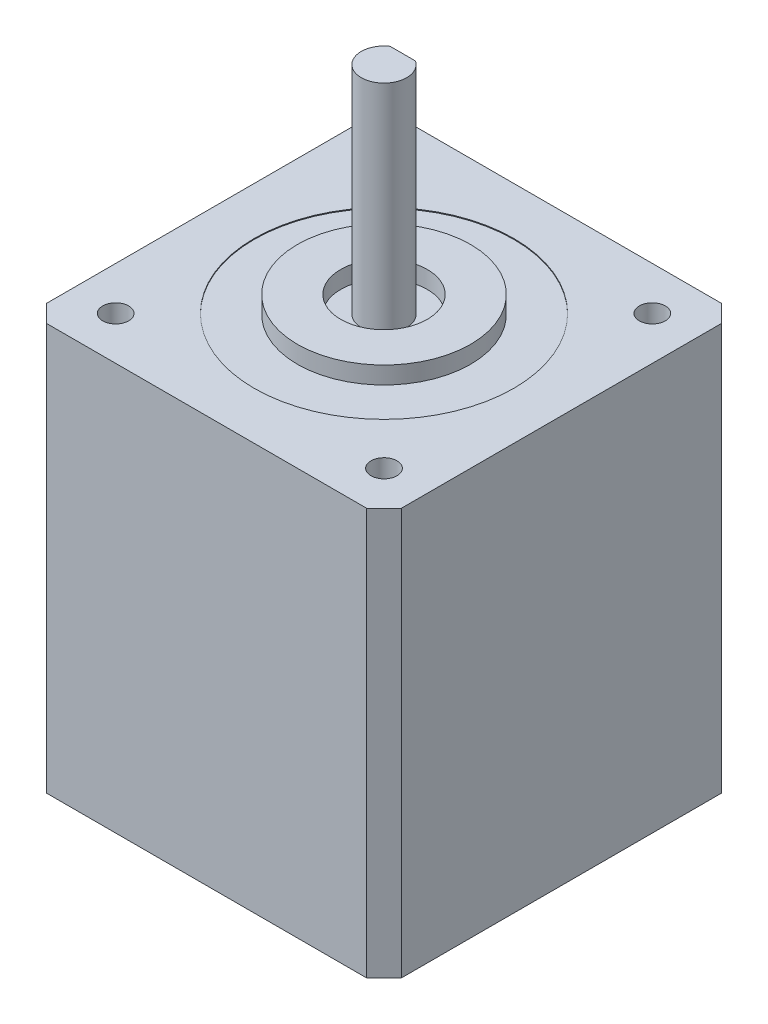
ISO-10303-21;
HEADER;
FILE_DESCRIPTION(('STEP AP214'),'2;1');
FILE_NAME('part.step','',(''),(''),'','','');
FILE_SCHEMA(('AUTOMOTIVE_DESIGN { 1 0 10303 214 1 1 1 1 }'));
ENDSEC;
DATA;
#1=APPLICATION_CONTEXT('core data for automotive mechanical design processes');
#2=APPLICATION_PROTOCOL_DEFINITION('international standard','automotive_design',2000,#1);
#3=PRODUCT_CONTEXT('',#1,'mechanical');
#4=PRODUCT('Part','Part','',(#3));
#5=PRODUCT_RELATED_PRODUCT_CATEGORY('part','',(#4));
#6=PRODUCT_DEFINITION_FORMATION('','',#4);
#7=PRODUCT_DEFINITION_CONTEXT('part definition',#1,'design');
#8=PRODUCT_DEFINITION('design','',#6,#7);
#9=PRODUCT_DEFINITION_SHAPE('','',#8);
#10=(LENGTH_UNIT() NAMED_UNIT(*) SI_UNIT(.MILLI.,.METRE.));
#11=(NAMED_UNIT(*) PLANE_ANGLE_UNIT() SI_UNIT($,.RADIAN.));
#12=(NAMED_UNIT(*) SI_UNIT($,.STERADIAN.) SOLID_ANGLE_UNIT());
#13=UNCERTAINTY_MEASURE_WITH_UNIT(LENGTH_MEASURE(1.E-05),#10,'distance_accuracy_value','');
#14=(GEOMETRIC_REPRESENTATION_CONTEXT(3) GLOBAL_UNCERTAINTY_ASSIGNED_CONTEXT((#13)) GLOBAL_UNIT_ASSIGNED_CONTEXT((#10,
#11,#12)) REPRESENTATION_CONTEXT('',''));
#15=CARTESIAN_POINT('',(0.,0.,0.));
#16=DIRECTION('',(0.,0.,1.));
#17=DIRECTION('',(1.,0.,0.));
#18=AXIS2_PLACEMENT_3D('',#15,#16,#17);
#19=CARTESIAN_POINT('',(0.,46.9,0.));
#20=DIRECTION('',(0.,1.,0.));
#21=DIRECTION('',(0.,0.,1.));
#22=AXIS2_PLACEMENT_3D('',#19,#20,#21);
#23=PLANE('',#22);
#24=CARTESIAN_POINT('',(0.,46.9,0.));
#25=DIRECTION('',(0.,1.,0.));
#26=DIRECTION('',(0.,0.,1.));
#27=AXIS2_PLACEMENT_3D('',#24,#25,#26);
#28=CIRCLE('',#27,5.);
#29=CARTESIAN_POINT('',(0.,46.9,5.));
#30=VERTEX_POINT('',#29);
#31=EDGE_CURVE('E11',#30,#30,#28,.F.);
#32=ORIENTED_EDGE('',*,*,#31,.F.);
#33=EDGE_LOOP('',(#32));
#34=FACE_BOUND('',#33,.T.);
#35=DIRECTION('',(-1.,0.,0.));
#36=VECTOR('',#35,1.);
#37=CARTESIAN_POINT('',(-1.47098416147173,46.9,-2.17535911633604));
#38=LINE('',#37,#36);
#39=CARTESIAN_POINT('',(1.47098416147173,46.9,-2.17535911633604));
#40=VERTEX_POINT('',#39);
#41=CARTESIAN_POINT('',(-1.47098416147173,46.9,-2.17535911633604));
#42=VERTEX_POINT('',#41);
#43=EDGE_CURVE('E257',#40,#42,#38,.T.);
#44=ORIENTED_EDGE('',*,*,#43,.F.);
#45=CARTESIAN_POINT('',(0.,46.9,0.));
#46=DIRECTION('',(0.,1.,0.));
#47=DIRECTION('',(0.,0.,1.));
#48=AXIS2_PLACEMENT_3D('',#45,#46,#47);
#49=CIRCLE('',#48,2.62602012336673);
#50=EDGE_CURVE('E59',#42,#40,#49,.T.);
#51=ORIENTED_EDGE('',*,*,#50,.F.);
#52=EDGE_LOOP('',(#44,#51));
#53=FACE_BOUND('',#52,.T.);
#54=ADVANCED_FACE('F43',(#34,#53),#23,.T.);
#55=CARTESIAN_POINT('',(0.,46.9,0.));
#56=DIRECTION('',(0.,1.,0.));
#57=DIRECTION('',(0.,0.,1.));
#58=AXIS2_PLACEMENT_3D('',#55,#56,#57);
#59=CIRCLE('',#58,15.);
#60=CARTESIAN_POINT('',(0.,46.9,15.));
#61=VERTEX_POINT('',#60);
#62=EDGE_CURVE('E163',#61,#61,#59,.T.);
#63=ORIENTED_EDGE('',*,*,#62,.T.);
#64=EDGE_LOOP('',(#63));
#65=FACE_BOUND('',#64,.T.);
#66=CARTESIAN_POINT('',(0.,46.9,0.));
#67=DIRECTION('',(0.,1.,0.));
#68=DIRECTION('',(0.,0.,1.));
#69=AXIS2_PLACEMENT_3D('',#66,#67,#68);
#70=CIRCLE('',#69,10.);
#71=CARTESIAN_POINT('',(0.,46.9,10.));
#72=VERTEX_POINT('',#71);
#73=EDGE_CURVE('E239',#72,#72,#70,.T.);
#74=ORIENTED_EDGE('',*,*,#73,.F.);
#75=EDGE_LOOP('',(#74));
#76=FACE_BOUND('',#75,.T.);
#77=ADVANCED_FACE('F333',(#65,#76),#23,.T.);
#78=CARTESIAN_POINT('',(-18.5,47.,-20.5));
#79=DIRECTION('',(0.,0.,1.));
#80=DIRECTION('',(1.,0.,0.));
#81=AXIS2_PLACEMENT_3D('',#78,#79,#80);
#82=PLANE('',#81);
#83=DIRECTION('',(-1.,0.,0.));
#84=VECTOR('',#83,1.);
#85=CARTESIAN_POINT('',(-18.5,0.,-20.5));
#86=LINE('',#85,#84);
#87=CARTESIAN_POINT('',(18.5,0.,-20.5));
#88=VERTEX_POINT('',#87);
#89=CARTESIAN_POINT('',(-18.5,0.,-20.5));
#90=VERTEX_POINT('',#89);
#91=EDGE_CURVE('E158',#88,#90,#86,.T.);
#92=ORIENTED_EDGE('',*,*,#91,.T.);
#93=DIRECTION('',(0.,-1.,0.));
#94=VECTOR('',#93,1.);
#95=CARTESIAN_POINT('',(-18.5,47.,-20.5));
#96=LINE('',#95,#94);
#97=CARTESIAN_POINT('',(-18.5,47.,-20.5));
#98=VERTEX_POINT('',#97);
#99=EDGE_CURVE('E52',#98,#90,#96,.T.);
#100=ORIENTED_EDGE('',*,*,#99,.F.);
#101=DIRECTION('',(-1.,0.,0.));
#102=VECTOR('',#101,1.);
#103=CARTESIAN_POINT('',(-18.5,47.,-20.5));
#104=LINE('',#103,#102);
#105=CARTESIAN_POINT('',(18.5,47.,-20.5));
#106=VERTEX_POINT('',#105);
#107=EDGE_CURVE('E182',#106,#98,#104,.T.);
#108=ORIENTED_EDGE('',*,*,#107,.F.);
#109=DIRECTION('',(0.,-1.,0.));
#110=VECTOR('',#109,1.);
#111=CARTESIAN_POINT('',(18.5,47.,-20.5));
#112=LINE('',#111,#110);
#113=EDGE_CURVE('E154',#106,#88,#112,.T.);
#114=ORIENTED_EDGE('',*,*,#113,.T.);
#115=EDGE_LOOP('',(#92,#100,#108,#114));
#116=FACE_BOUND('',#115,.T.);
#117=ADVANCED_FACE('F45',(#116),#82,.F.);
#118=CARTESIAN_POINT('',(-20.5,47.,-18.5));
#119=DIRECTION('',(0.707106781186547,0.,0.707106781186548));
#120=DIRECTION('',(0.707106781186548,0.,-0.707106781186547));
#121=AXIS2_PLACEMENT_3D('',#118,#119,#120);
#122=PLANE('',#121);
#123=DIRECTION('',(-0.707106781186548,0.,0.707106781186547));
#124=VECTOR('',#123,1.);
#125=CARTESIAN_POINT('',(-20.5,0.,-18.5));
#126=LINE('',#125,#124);
#127=CARTESIAN_POINT('',(-20.5,0.,-18.5));
#128=VERTEX_POINT('',#127);
#129=EDGE_CURVE('E162',#90,#128,#126,.T.);
#130=ORIENTED_EDGE('',*,*,#129,.T.);
#131=DIRECTION('',(0.,-1.,0.));
#132=VECTOR('',#131,1.);
#133=CARTESIAN_POINT('',(-20.5,47.,-18.5));
#134=LINE('',#133,#132);
#135=CARTESIAN_POINT('',(-20.5,47.,-18.5));
#136=VERTEX_POINT('',#135);
#137=EDGE_CURVE('E197',#136,#128,#134,.T.);
#138=ORIENTED_EDGE('',*,*,#137,.F.);
#139=DIRECTION('',(-0.707106781186548,0.,0.707106781186547));
#140=VECTOR('',#139,1.);
#141=CARTESIAN_POINT('',(-20.5,47.,-18.5));
#142=LINE('',#141,#140);
#143=EDGE_CURVE('E110',#98,#136,#142,.T.);
#144=ORIENTED_EDGE('',*,*,#143,.F.);
#145=ORIENTED_EDGE('',*,*,#99,.T.);
#146=EDGE_LOOP('',(#130,#138,#144,#145));
#147=FACE_BOUND('',#146,.T.);
#148=ADVANCED_FACE('F202',(#147),#122,.F.);
#149=CARTESIAN_POINT('',(-20.5,47.,18.5));
#150=DIRECTION('',(1.,0.,0.));
#151=DIRECTION('',(0.,0.,-1.));
#152=AXIS2_PLACEMENT_3D('',#149,#150,#151);
#153=PLANE('',#152);
#154=DIRECTION('',(0.,0.,1.));
#155=VECTOR('',#154,1.);
#156=CARTESIAN_POINT('',(-20.5,0.,18.5));
#157=LINE('',#156,#155);
#158=CARTESIAN_POINT('',(-20.5,0.,18.5));
#159=VERTEX_POINT('',#158);
#160=EDGE_CURVE('E166',#128,#159,#157,.T.);
#161=ORIENTED_EDGE('',*,*,#160,.T.);
#162=DIRECTION('',(0.,-1.,0.));
#163=VECTOR('',#162,1.);
#164=CARTESIAN_POINT('',(-20.5,47.,18.5));
#165=LINE('',#164,#163);
#166=CARTESIAN_POINT('',(-20.5,47.,18.5));
#167=VERTEX_POINT('',#166);
#168=EDGE_CURVE('E193',#167,#159,#165,.T.);
#169=ORIENTED_EDGE('',*,*,#168,.F.);
#170=DIRECTION('',(0.,0.,1.));
#171=VECTOR('',#170,1.);
#172=CARTESIAN_POINT('',(-20.5,47.,18.5));
#173=LINE('',#172,#171);
#174=EDGE_CURVE('E221',#136,#167,#173,.T.);
#175=ORIENTED_EDGE('',*,*,#174,.F.);
#176=ORIENTED_EDGE('',*,*,#137,.T.);
#177=EDGE_LOOP('',(#161,#169,#175,#176));
#178=FACE_BOUND('',#177,.T.);
#179=ADVANCED_FACE('F213',(#178),#153,.F.);
#180=CARTESIAN_POINT('',(-18.5,47.,20.5));
#181=DIRECTION('',(0.707106781186547,0.,-0.707106781186548));
#182=DIRECTION('',(-0.707106781186548,0.,-0.707106781186547));
#183=AXIS2_PLACEMENT_3D('',#180,#181,#182);
#184=PLANE('',#183);
#185=DIRECTION('',(0.707106781186548,0.,0.707106781186547));
#186=VECTOR('',#185,1.);
#187=CARTESIAN_POINT('',(-18.5,0.,20.5));
#188=LINE('',#187,#186);
#189=CARTESIAN_POINT('',(-18.5,0.,20.5));
#190=VERTEX_POINT('',#189);
#191=EDGE_CURVE('E169',#159,#190,#188,.T.);
#192=ORIENTED_EDGE('',*,*,#191,.T.);
#193=DIRECTION('',(0.,-1.,0.));
#194=VECTOR('',#193,1.);
#195=CARTESIAN_POINT('',(-18.5,47.,20.5));
#196=LINE('',#195,#194);
#197=CARTESIAN_POINT('',(-18.5,47.,20.5));
#198=VERTEX_POINT('',#197);
#199=EDGE_CURVE('E189',#198,#190,#196,.T.);
#200=ORIENTED_EDGE('',*,*,#199,.F.);
#201=DIRECTION('',(0.707106781186548,0.,0.707106781186547));
#202=VECTOR('',#201,1.);
#203=CARTESIAN_POINT('',(-18.5,47.,20.5));
#204=LINE('',#203,#202);
#205=EDGE_CURVE('E219',#167,#198,#204,.T.);
#206=ORIENTED_EDGE('',*,*,#205,.F.);
#207=ORIENTED_EDGE('',*,*,#168,.T.);
#208=EDGE_LOOP('',(#192,#200,#206,#207));
#209=FACE_BOUND('',#208,.T.);
#210=ADVANCED_FACE('F217',(#209),#184,.F.);
#211=CARTESIAN_POINT('',(-18.5,47.,20.5));
#212=DIRECTION('',(0.,0.,-1.));
#213=DIRECTION('',(-1.,0.,0.));
#214=AXIS2_PLACEMENT_3D('',#211,#212,#213);
#215=PLANE('',#214);
#216=DIRECTION('',(1.,0.,0.));
#217=VECTOR('',#216,1.);
#218=CARTESIAN_POINT('',(-18.5,0.,20.5));
#219=LINE('',#218,#217);
#220=CARTESIAN_POINT('',(18.5,0.,20.5));
#221=VERTEX_POINT('',#220);
#222=EDGE_CURVE('E172',#190,#221,#219,.T.);
#223=ORIENTED_EDGE('',*,*,#222,.T.);
#224=DIRECTION('',(0.,-1.,0.));
#225=VECTOR('',#224,1.);
#226=CARTESIAN_POINT('',(18.5,47.,20.5));
#227=LINE('',#226,#225);
#228=CARTESIAN_POINT('',(18.5,47.,20.5));
#229=VERTEX_POINT('',#228);
#230=EDGE_CURVE('E147',#229,#221,#227,.T.);
#231=ORIENTED_EDGE('',*,*,#230,.F.);
#232=DIRECTION('',(1.,0.,0.));
#233=VECTOR('',#232,1.);
#234=CARTESIAN_POINT('',(-18.5,47.,20.5));
#235=LINE('',#234,#233);
#236=EDGE_CURVE('E133',#198,#229,#235,.T.);
#237=ORIENTED_EDGE('',*,*,#236,.F.);
#238=ORIENTED_EDGE('',*,*,#199,.T.);
#239=EDGE_LOOP('',(#223,#231,#237,#238));
#240=FACE_BOUND('',#239,.T.);
#241=ADVANCED_FACE('F496',(#240),#215,.F.);
#242=CARTESIAN_POINT('',(18.5,47.,20.5));
#243=DIRECTION('',(-0.707106781186547,0.,-0.707106781186548));
#244=DIRECTION('',(-0.707106781186548,0.,0.707106781186547));
#245=AXIS2_PLACEMENT_3D('',#242,#243,#244);
#246=PLANE('',#245);
#247=DIRECTION('',(0.707106781186548,0.,-0.707106781186547));
#248=VECTOR('',#247,1.);
#249=CARTESIAN_POINT('',(18.5,0.,20.5));
#250=LINE('',#249,#248);
#251=CARTESIAN_POINT('',(20.5,0.,18.5));
#252=VERTEX_POINT('',#251);
#253=EDGE_CURVE('E143',#221,#252,#250,.T.);
#254=ORIENTED_EDGE('',*,*,#253,.T.);
#255=DIRECTION('',(0.,-1.,0.));
#256=VECTOR('',#255,1.);
#257=CARTESIAN_POINT('',(20.5,47.,18.5));
#258=LINE('',#257,#256);
#259=CARTESIAN_POINT('',(20.5,47.,18.5));
#260=VERTEX_POINT('',#259);
#261=EDGE_CURVE('E140',#260,#252,#258,.T.);
#262=ORIENTED_EDGE('',*,*,#261,.F.);
#263=DIRECTION('',(0.707106781186548,0.,-0.707106781186547));
#264=VECTOR('',#263,1.);
#265=CARTESIAN_POINT('',(18.5,47.,20.5));
#266=LINE('',#265,#264);
#267=EDGE_CURVE('E126',#229,#260,#266,.T.);
#268=ORIENTED_EDGE('',*,*,#267,.F.);
#269=ORIENTED_EDGE('',*,*,#230,.T.);
#270=EDGE_LOOP('',(#254,#262,#268,#269));
#271=FACE_BOUND('',#270,.T.);
#272=ADVANCED_FACE('F141',(#271),#246,.F.);
#273=CARTESIAN_POINT('',(20.5,47.,18.5));
#274=DIRECTION('',(-1.,0.,0.));
#275=DIRECTION('',(0.,0.,1.));
#276=AXIS2_PLACEMENT_3D('',#273,#274,#275);
#277=PLANE('',#276);
#278=DIRECTION('',(0.,0.,-1.));
#279=VECTOR('',#278,1.);
#280=CARTESIAN_POINT('',(20.5,0.,18.5));
#281=LINE('',#280,#279);
#282=CARTESIAN_POINT('',(20.5,0.,-18.5));
#283=VERTEX_POINT('',#282);
#284=EDGE_CURVE('E177',#252,#283,#281,.T.);
#285=ORIENTED_EDGE('',*,*,#284,.T.);
#286=DIRECTION('',(0.,-1.,0.));
#287=VECTOR('',#286,1.);
#288=CARTESIAN_POINT('',(20.5,47.,-18.5));
#289=LINE('',#288,#287);
#290=CARTESIAN_POINT('',(20.5,47.,-18.5));
#291=VERTEX_POINT('',#290);
#292=EDGE_CURVE('E148',#291,#283,#289,.T.);
#293=ORIENTED_EDGE('',*,*,#292,.F.);
#294=DIRECTION('',(0.,0.,-1.));
#295=VECTOR('',#294,1.);
#296=CARTESIAN_POINT('',(20.5,47.,18.5));
#297=LINE('',#296,#295);
#298=EDGE_CURVE('E130',#260,#291,#297,.T.);
#299=ORIENTED_EDGE('',*,*,#298,.F.);
#300=ORIENTED_EDGE('',*,*,#261,.T.);
#301=EDGE_LOOP('',(#285,#293,#299,#300));
#302=FACE_BOUND('',#301,.T.);
#303=ADVANCED_FACE('F150',(#302),#277,.F.);
#304=CARTESIAN_POINT('',(20.5,47.,-18.5));
#305=DIRECTION('',(-0.707106781186547,0.,0.707106781186547));
#306=DIRECTION('',(0.707106781186548,0.,0.707106781186548));
#307=AXIS2_PLACEMENT_3D('',#304,#305,#306);
#308=PLANE('',#307);
#309=DIRECTION('',(-0.707106781186547,0.,-0.707106781186547));
#310=VECTOR('',#309,1.);
#311=CARTESIAN_POINT('',(20.5,0.,-18.5));
#312=LINE('',#311,#310);
#313=EDGE_CURVE('E101',#283,#88,#312,.T.);
#314=ORIENTED_EDGE('',*,*,#313,.T.);
#315=ORIENTED_EDGE('',*,*,#113,.F.);
#316=DIRECTION('',(-0.707106781186547,0.,-0.707106781186547));
#317=VECTOR('',#316,1.);
#318=CARTESIAN_POINT('',(20.5,47.,-18.5));
#319=LINE('',#318,#317);
#320=EDGE_CURVE('E68',#291,#106,#319,.T.);
#321=ORIENTED_EDGE('',*,*,#320,.F.);
#322=ORIENTED_EDGE('',*,*,#292,.T.);
#323=EDGE_LOOP('',(#314,#315,#321,#322));
#324=FACE_BOUND('',#323,.T.);
#325=ADVANCED_FACE('F307',(#324),#308,.F.);
#326=CARTESIAN_POINT('',(20.5,47.,-20.5));
#327=DIRECTION('',(0.,1.,0.));
#328=DIRECTION('',(0.,0.,1.));
#329=AXIS2_PLACEMENT_3D('',#326,#327,#328);
#330=PLANE('',#329);
#331=CARTESIAN_POINT('',(15.5,47.,-15.5));
#332=DIRECTION('',(0.,1.,0.));
#333=DIRECTION('',(0.,0.,1.));
#334=AXIS2_PLACEMENT_3D('',#331,#332,#333);
#335=CIRCLE('',#334,1.5);
#336=CARTESIAN_POINT('',(15.5,47.,-14.));
#337=VERTEX_POINT('',#336);
#338=EDGE_CURVE('E298',#337,#337,#335,.T.);
#339=ORIENTED_EDGE('',*,*,#338,.F.);
#340=EDGE_LOOP('',(#339));
#341=FACE_BOUND('',#340,.T.);
#342=CARTESIAN_POINT('',(-15.5,47.,-15.5));
#343=DIRECTION('',(0.,1.,0.));
#344=DIRECTION('',(0.,0.,1.));
#345=AXIS2_PLACEMENT_3D('',#342,#343,#344);
#346=CIRCLE('',#345,1.5);
#347=CARTESIAN_POINT('',(-15.5,47.,-14.));
#348=VERTEX_POINT('',#347);
#349=EDGE_CURVE('E290',#348,#348,#346,.T.);
#350=ORIENTED_EDGE('',*,*,#349,.F.);
#351=EDGE_LOOP('',(#350));
#352=FACE_BOUND('',#351,.T.);
#353=CARTESIAN_POINT('',(-15.5,47.,15.5));
#354=DIRECTION('',(0.,1.,0.));
#355=DIRECTION('',(0.,0.,1.));
#356=AXIS2_PLACEMENT_3D('',#353,#354,#355);
#357=CIRCLE('',#356,1.5);
#358=CARTESIAN_POINT('',(-15.5,47.,17.));
#359=VERTEX_POINT('',#358);
#360=EDGE_CURVE('E282',#359,#359,#357,.T.);
#361=ORIENTED_EDGE('',*,*,#360,.F.);
#362=EDGE_LOOP('',(#361));
#363=FACE_BOUND('',#362,.T.);
#364=CARTESIAN_POINT('',(15.5,47.,15.5));
#365=DIRECTION('',(0.,1.,0.));
#366=DIRECTION('',(0.,0.,1.));
#367=AXIS2_PLACEMENT_3D('',#364,#365,#366);
#368=CIRCLE('',#367,1.5);
#369=CARTESIAN_POINT('',(15.5,47.,17.));
#370=VERTEX_POINT('',#369);
#371=EDGE_CURVE('E274',#370,#370,#368,.T.);
#372=ORIENTED_EDGE('',*,*,#371,.F.);
#373=EDGE_LOOP('',(#372));
#374=FACE_BOUND('',#373,.T.);
#375=CARTESIAN_POINT('',(0.,47.,0.));
#376=DIRECTION('',(0.,1.,0.));
#377=DIRECTION('',(0.,0.,1.));
#378=AXIS2_PLACEMENT_3D('',#375,#376,#377);
#379=CIRCLE('',#378,15.);
#380=CARTESIAN_POINT('',(0.,47.,15.));
#381=VERTEX_POINT('',#380);
#382=EDGE_CURVE('E231',#381,#381,#379,.T.);
#383=ORIENTED_EDGE('',*,*,#382,.F.);
#384=EDGE_LOOP('',(#383));
#385=FACE_BOUND('',#384,.T.);
#386=ORIENTED_EDGE('',*,*,#107,.T.);
#387=ORIENTED_EDGE('',*,*,#143,.T.);
#388=ORIENTED_EDGE('',*,*,#174,.T.);
#389=ORIENTED_EDGE('',*,*,#205,.T.);
#390=ORIENTED_EDGE('',*,*,#236,.T.);
#391=ORIENTED_EDGE('',*,*,#267,.T.);
#392=ORIENTED_EDGE('',*,*,#298,.T.);
#393=ORIENTED_EDGE('',*,*,#320,.T.);
#394=EDGE_LOOP('',(#386,#387,#388,#389,#390,#391,#392,#393));
#395=FACE_BOUND('',#394,.T.);
#396=ADVANCED_FACE('F128',(#341,#352,#363,#374,#385,#395),#330,.T.);
#397=CARTESIAN_POINT('',(20.5,0.,-20.5));
#398=DIRECTION('',(0.,1.,0.));
#399=DIRECTION('',(0.,0.,1.));
#400=AXIS2_PLACEMENT_3D('',#397,#398,#399);
#401=PLANE('',#400);
#402=ORIENTED_EDGE('',*,*,#91,.F.);
#403=ORIENTED_EDGE('',*,*,#313,.F.);
#404=ORIENTED_EDGE('',*,*,#284,.F.);
#405=ORIENTED_EDGE('',*,*,#253,.F.);
#406=ORIENTED_EDGE('',*,*,#222,.F.);
#407=ORIENTED_EDGE('',*,*,#191,.F.);
#408=ORIENTED_EDGE('',*,*,#160,.F.);
#409=ORIENTED_EDGE('',*,*,#129,.F.);
#410=EDGE_LOOP('',(#402,#403,#404,#405,#406,#407,#408,#409));
#411=FACE_BOUND('',#410,.T.);
#412=ADVANCED_FACE('F207',(#411),#401,.F.);
#413=CARTESIAN_POINT('',(0.,46.9,0.));
#414=DIRECTION('',(0.,1.,0.));
#415=DIRECTION('',(0.,0.,1.));
#416=AXIS2_PLACEMENT_3D('',#413,#414,#415);
#417=CYLINDRICAL_SURFACE('',#416,15.);
#418=ORIENTED_EDGE('',*,*,#62,.F.);
#419=EDGE_LOOP('',(#418));
#420=FACE_BOUND('',#419,.T.);
#421=ORIENTED_EDGE('',*,*,#382,.T.);
#422=EDGE_LOOP('',(#421));
#423=FACE_BOUND('',#422,.T.);
#424=ADVANCED_FACE('F317',(#420,#423),#417,.F.);
#425=CARTESIAN_POINT('',(0.,48.9,0.));
#426=DIRECTION('',(0.,1.,0.));
#427=DIRECTION('',(0.,0.,1.));
#428=AXIS2_PLACEMENT_3D('',#425,#426,#427);
#429=PLANE('',#428);
#430=CARTESIAN_POINT('',(0.,48.9,0.));
#431=DIRECTION('',(0.,1.,0.));
#432=DIRECTION('',(0.,0.,1.));
#433=AXIS2_PLACEMENT_3D('',#430,#431,#432);
#434=CIRCLE('',#433,10.);
#435=CARTESIAN_POINT('',(0.,48.9,10.));
#436=VERTEX_POINT('',#435);
#437=EDGE_CURVE('E235',#436,#436,#434,.T.);
#438=ORIENTED_EDGE('',*,*,#437,.T.);
#439=EDGE_LOOP('',(#438));
#440=FACE_BOUND('',#439,.T.);
#441=CARTESIAN_POINT('',(0.,48.9,0.));
#442=DIRECTION('',(0.,1.,0.));
#443=DIRECTION('',(0.,0.,1.));
#444=AXIS2_PLACEMENT_3D('',#441,#442,#443);
#445=CIRCLE('',#444,5.);
#446=CARTESIAN_POINT('',(0.,48.9,5.));
#447=VERTEX_POINT('',#446);
#448=EDGE_CURVE('E243',#447,#447,#445,.T.);
#449=ORIENTED_EDGE('',*,*,#448,.F.);
#450=EDGE_LOOP('',(#449));
#451=FACE_BOUND('',#450,.T.);
#452=ADVANCED_FACE('F319',(#440,#451),#429,.T.);
#453=CARTESIAN_POINT('',(0.,48.9,0.));
#454=DIRECTION('',(0.,-1.,0.));
#455=DIRECTION('',(0.,0.,-1.));
#456=AXIS2_PLACEMENT_3D('',#453,#454,#455);
#457=CYLINDRICAL_SURFACE('',#456,10.);
#458=ORIENTED_EDGE('',*,*,#437,.F.);
#459=EDGE_LOOP('',(#458));
#460=FACE_BOUND('',#459,.T.);
#461=ORIENTED_EDGE('',*,*,#73,.T.);
#462=EDGE_LOOP('',(#461));
#463=FACE_BOUND('',#462,.T.);
#464=ADVANCED_FACE('F326',(#460,#463),#457,.T.);
#465=CARTESIAN_POINT('',(0.,48.9,0.));
#466=DIRECTION('',(0.,-1.,0.));
#467=DIRECTION('',(0.,0.,-1.));
#468=AXIS2_PLACEMENT_3D('',#465,#466,#467);
#469=CYLINDRICAL_SURFACE('',#468,5.);
#470=ORIENTED_EDGE('',*,*,#448,.T.);
#471=EDGE_LOOP('',(#470));
#472=FACE_BOUND('',#471,.T.);
#473=ORIENTED_EDGE('',*,*,#31,.T.);
#474=EDGE_LOOP('',(#473));
#475=FACE_BOUND('',#474,.T.);
#476=ADVANCED_FACE('F343',(#472,#475),#469,.F.);
#477=CARTESIAN_POINT('',(0.,71.9,0.));
#478=DIRECTION('',(0.,-1.,0.));
#479=DIRECTION('',(0.,0.,-1.));
#480=AXIS2_PLACEMENT_3D('',#477,#478,#479);
#481=CYLINDRICAL_SURFACE('',#480,2.62602012336673);
#482=ORIENTED_EDGE('',*,*,#50,.T.);
#483=DIRECTION('',(0.,-1.,0.));
#484=VECTOR('',#483,1.);
#485=CARTESIAN_POINT('',(1.47098416147173,71.9,-2.17535911633604));
#486=LINE('',#485,#484);
#487=CARTESIAN_POINT('',(1.47098416147173,71.9,-2.17535911633604));
#488=VERTEX_POINT('',#487);
#489=EDGE_CURVE('E250',#488,#40,#486,.T.);
#490=ORIENTED_EDGE('',*,*,#489,.F.);
#491=CARTESIAN_POINT('',(0.,71.9,0.));
#492=DIRECTION('',(0.,1.,0.));
#493=DIRECTION('',(0.,0.,1.));
#494=AXIS2_PLACEMENT_3D('',#491,#492,#493);
#495=CIRCLE('',#494,2.62602012336673);
#496=CARTESIAN_POINT('',(-1.47098416147173,71.9,-2.17535911633604));
#497=VERTEX_POINT('',#496);
#498=EDGE_CURVE('E261',#497,#488,#495,.T.);
#499=ORIENTED_EDGE('',*,*,#498,.F.);
#500=DIRECTION('',(0.,-1.,0.));
#501=VECTOR('',#500,1.);
#502=CARTESIAN_POINT('',(-1.47098416147173,71.9,-2.17535911633604));
#503=LINE('',#502,#501);
#504=EDGE_CURVE('E253',#497,#42,#503,.T.);
#505=ORIENTED_EDGE('',*,*,#504,.T.);
#506=EDGE_LOOP('',(#482,#490,#499,#505));
#507=FACE_BOUND('',#506,.T.);
#508=ADVANCED_FACE('F348',(#507),#481,.T.);
#509=CARTESIAN_POINT('',(-1.47098416147173,71.9,-2.17535911633604));
#510=DIRECTION('',(0.,0.,1.));
#511=DIRECTION('',(1.,0.,0.));
#512=AXIS2_PLACEMENT_3D('',#509,#510,#511);
#513=PLANE('',#512);
#514=ORIENTED_EDGE('',*,*,#43,.T.);
#515=ORIENTED_EDGE('',*,*,#504,.F.);
#516=DIRECTION('',(-1.,0.,0.));
#517=VECTOR('',#516,1.);
#518=CARTESIAN_POINT('',(-1.47098416147173,71.9,-2.17535911633604));
#519=LINE('',#518,#517);
#520=EDGE_CURVE('E256',#488,#497,#519,.T.);
#521=ORIENTED_EDGE('',*,*,#520,.F.);
#522=ORIENTED_EDGE('',*,*,#489,.T.);
#523=EDGE_LOOP('',(#514,#515,#521,#522));
#524=FACE_BOUND('',#523,.T.);
#525=ADVANCED_FACE('F352',(#524),#513,.F.);
#526=CARTESIAN_POINT('',(0.,71.9,0.));
#527=DIRECTION('',(0.,1.,0.));
#528=DIRECTION('',(0.,0.,1.));
#529=AXIS2_PLACEMENT_3D('',#526,#527,#528);
#530=PLANE('',#529);
#531=ORIENTED_EDGE('',*,*,#498,.T.);
#532=ORIENTED_EDGE('',*,*,#520,.T.);
#533=EDGE_LOOP('',(#531,#532));
#534=FACE_BOUND('',#533,.T.);
#535=ADVANCED_FACE('F355',(#534),#530,.T.);
#536=CARTESIAN_POINT('',(15.5,42.,15.5));
#537=DIRECTION('',(0.,1.,0.));
#538=DIRECTION('',(0.,0.,1.));
#539=AXIS2_PLACEMENT_3D('',#536,#537,#538);
#540=CONICAL_SURFACE('',#539,1.5,1.02974425867665);
#541=CARTESIAN_POINT('',(15.5,41.0987090714587,15.5));
#542=VERTEX_POINT('',#541);
#543=VERTEX_LOOP('',#542);
#544=FACE_BOUND('',#543,.T.);
#545=CARTESIAN_POINT('',(15.5,42.,15.5));
#546=DIRECTION('',(0.,1.,0.));
#547=DIRECTION('',(0.,0.,1.));
#548=AXIS2_PLACEMENT_3D('',#545,#546,#547);
#549=CIRCLE('',#548,1.5);
#550=CARTESIAN_POINT('',(15.5,42.,17.));
#551=VERTEX_POINT('',#550);
#552=EDGE_CURVE('E264',#551,#551,#549,.T.);
#553=ORIENTED_EDGE('',*,*,#552,.T.);
#554=EDGE_LOOP('',(#553));
#555=FACE_BOUND('',#554,.T.);
#556=ADVANCED_FACE('F359',(#544,#555),#540,.F.);
#557=CARTESIAN_POINT('',(15.5,47.,15.5));
#558=DIRECTION('',(0.,1.,0.));
#559=DIRECTION('',(0.,0.,1.));
#560=AXIS2_PLACEMENT_3D('',#557,#558,#559);
#561=CYLINDRICAL_SURFACE('',#560,1.5);
#562=ORIENTED_EDGE('',*,*,#552,.F.);
#563=EDGE_LOOP('',(#562));
#564=FACE_BOUND('',#563,.T.);
#565=ORIENTED_EDGE('',*,*,#371,.T.);
#566=EDGE_LOOP('',(#565));
#567=FACE_BOUND('',#566,.T.);
#568=ADVANCED_FACE('F363',(#564,#567),#561,.F.);
#569=CARTESIAN_POINT('',(-15.5,42.,15.5));
#570=DIRECTION('',(0.,1.,0.));
#571=DIRECTION('',(0.,0.,1.));
#572=AXIS2_PLACEMENT_3D('',#569,#570,#571);
#573=CONICAL_SURFACE('',#572,1.5,1.02974425867665);
#574=CARTESIAN_POINT('',(-15.5,41.0987090714587,15.5));
#575=VERTEX_POINT('',#574);
#576=VERTEX_LOOP('',#575);
#577=FACE_BOUND('',#576,.T.);
#578=CARTESIAN_POINT('',(-15.5,42.,15.5));
#579=DIRECTION('',(0.,1.,0.));
#580=DIRECTION('',(0.,0.,1.));
#581=AXIS2_PLACEMENT_3D('',#578,#579,#580);
#582=CIRCLE('',#581,1.5);
#583=CARTESIAN_POINT('',(-15.5,42.,17.));
#584=VERTEX_POINT('',#583);
#585=EDGE_CURVE('E278',#584,#584,#582,.T.);
#586=ORIENTED_EDGE('',*,*,#585,.T.);
#587=EDGE_LOOP('',(#586));
#588=FACE_BOUND('',#587,.T.);
#589=ADVANCED_FACE('F367',(#577,#588),#573,.F.);
#590=CARTESIAN_POINT('',(-15.5,47.,15.5));
#591=DIRECTION('',(0.,1.,0.));
#592=DIRECTION('',(0.,0.,1.));
#593=AXIS2_PLACEMENT_3D('',#590,#591,#592);
#594=CYLINDRICAL_SURFACE('',#593,1.5);
#595=ORIENTED_EDGE('',*,*,#585,.F.);
#596=EDGE_LOOP('',(#595));
#597=FACE_BOUND('',#596,.T.);
#598=ORIENTED_EDGE('',*,*,#360,.T.);
#599=EDGE_LOOP('',(#598));
#600=FACE_BOUND('',#599,.T.);
#601=ADVANCED_FACE('F371',(#597,#600),#594,.F.);
#602=CARTESIAN_POINT('',(-15.5,42.,-15.5));
#603=DIRECTION('',(0.,1.,0.));
#604=DIRECTION('',(0.,0.,1.));
#605=AXIS2_PLACEMENT_3D('',#602,#603,#604);
#606=CONICAL_SURFACE('',#605,1.5,1.02974425867665);
#607=CARTESIAN_POINT('',(-15.5,41.0987090714587,-15.5));
#608=VERTEX_POINT('',#607);
#609=VERTEX_LOOP('',#608);
#610=FACE_BOUND('',#609,.T.);
#611=CARTESIAN_POINT('',(-15.5,42.,-15.5));
#612=DIRECTION('',(0.,1.,0.));
#613=DIRECTION('',(0.,0.,1.));
#614=AXIS2_PLACEMENT_3D('',#611,#612,#613);
#615=CIRCLE('',#614,1.5);
#616=CARTESIAN_POINT('',(-15.5,42.,-14.));
#617=VERTEX_POINT('',#616);
#618=EDGE_CURVE('E286',#617,#617,#615,.T.);
#619=ORIENTED_EDGE('',*,*,#618,.T.);
#620=EDGE_LOOP('',(#619));
#621=FACE_BOUND('',#620,.T.);
#622=ADVANCED_FACE('F375',(#610,#621),#606,.F.);
#623=CARTESIAN_POINT('',(-15.5,47.,-15.5));
#624=DIRECTION('',(0.,1.,0.));
#625=DIRECTION('',(0.,0.,1.));
#626=AXIS2_PLACEMENT_3D('',#623,#624,#625);
#627=CYLINDRICAL_SURFACE('',#626,1.5);
#628=ORIENTED_EDGE('',*,*,#618,.F.);
#629=EDGE_LOOP('',(#628));
#630=FACE_BOUND('',#629,.T.);
#631=ORIENTED_EDGE('',*,*,#349,.T.);
#632=EDGE_LOOP('',(#631));
#633=FACE_BOUND('',#632,.T.);
#634=ADVANCED_FACE('F379',(#630,#633),#627,.F.);
#635=CARTESIAN_POINT('',(15.5,42.,-15.5));
#636=DIRECTION('',(0.,1.,0.));
#637=DIRECTION('',(0.,0.,1.));
#638=AXIS2_PLACEMENT_3D('',#635,#636,#637);
#639=CONICAL_SURFACE('',#638,1.5,1.02974425867665);
#640=CARTESIAN_POINT('',(15.5,41.0987090714587,-15.5));
#641=VERTEX_POINT('',#640);
#642=VERTEX_LOOP('',#641);
#643=FACE_BOUND('',#642,.T.);
#644=CARTESIAN_POINT('',(15.5,42.,-15.5));
#645=DIRECTION('',(0.,1.,0.));
#646=DIRECTION('',(0.,0.,1.));
#647=AXIS2_PLACEMENT_3D('',#644,#645,#646);
#648=CIRCLE('',#647,1.5);
#649=CARTESIAN_POINT('',(15.5,42.,-14.));
#650=VERTEX_POINT('',#649);
#651=EDGE_CURVE('E294',#650,#650,#648,.T.);
#652=ORIENTED_EDGE('',*,*,#651,.T.);
#653=EDGE_LOOP('',(#652));
#654=FACE_BOUND('',#653,.T.);
#655=ADVANCED_FACE('F383',(#643,#654),#639,.F.);
#656=CARTESIAN_POINT('',(15.5,47.,-15.5));
#657=DIRECTION('',(0.,1.,0.));
#658=DIRECTION('',(0.,0.,1.));
#659=AXIS2_PLACEMENT_3D('',#656,#657,#658);
#660=CYLINDRICAL_SURFACE('',#659,1.5);
#661=ORIENTED_EDGE('',*,*,#651,.F.);
#662=EDGE_LOOP('',(#661));
#663=FACE_BOUND('',#662,.T.);
#664=ORIENTED_EDGE('',*,*,#338,.T.);
#665=EDGE_LOOP('',(#664));
#666=FACE_BOUND('',#665,.T.);
#667=ADVANCED_FACE('F303',(#663,#666),#660,.F.);
#668=CLOSED_SHELL('',(#54,#77,#117,#148,#179,#210,#241,#272,#303,#325,#396,#412,#424,#452,#464,
#476,#508,#525,#535,#556,#568,#589,#601,#622,#634,#655,#667));
#669=MANIFOLD_SOLID_BREP('B2',#668);
#670=ADVANCED_BREP_SHAPE_REPRESENTATION('',(#18,#669),#14);
#671=SHAPE_DEFINITION_REPRESENTATION(#9,#670);
ENDSEC;
END-ISO-10303-21;
